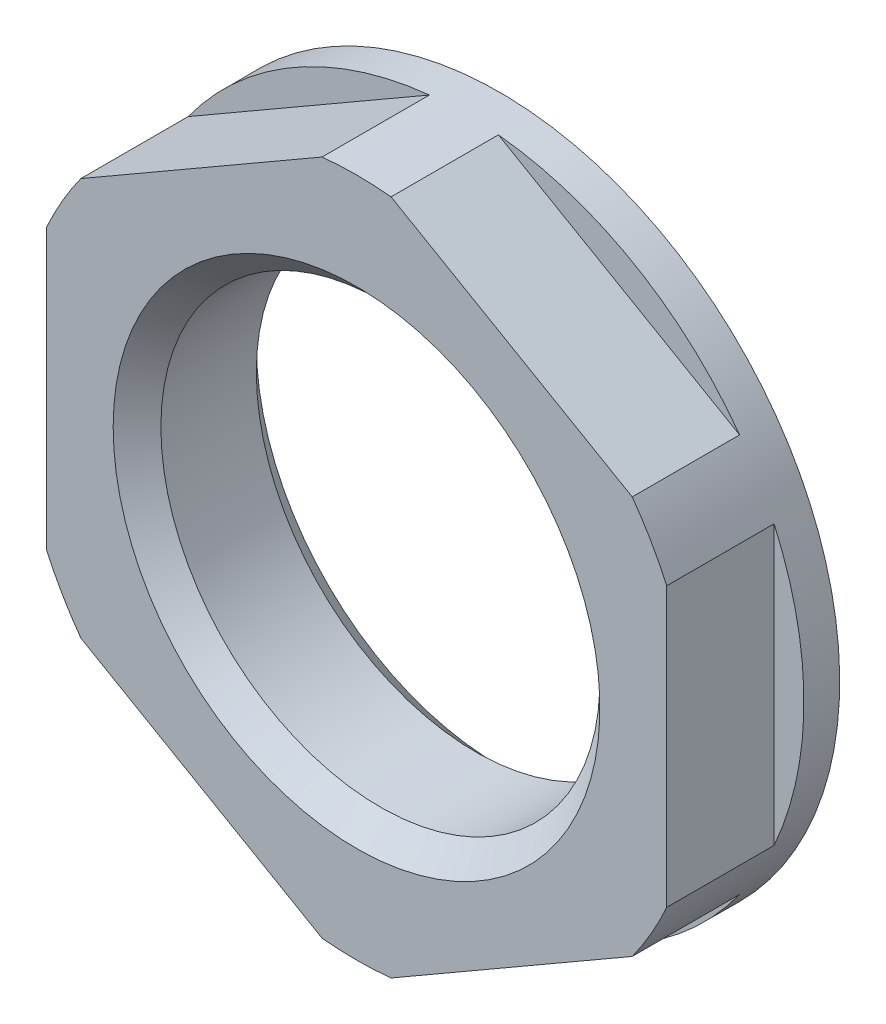
ISO-10303-21;
HEADER;
FILE_DESCRIPTION(('STEP AP214'),'2;1');
FILE_NAME('part.step','',(''),(''),'','','');
FILE_SCHEMA(('AUTOMOTIVE_DESIGN { 1 0 10303 214 1 1 1 1 }'));
ENDSEC;
DATA;
#1=APPLICATION_CONTEXT('core data for automotive mechanical design processes');
#2=APPLICATION_PROTOCOL_DEFINITION('international standard','automotive_design',2000,#1);
#3=PRODUCT_CONTEXT('',#1,'mechanical');
#4=PRODUCT('Part','Part','',(#3));
#5=PRODUCT_RELATED_PRODUCT_CATEGORY('part','',(#4));
#6=PRODUCT_DEFINITION_FORMATION('','',#4);
#7=PRODUCT_DEFINITION_CONTEXT('part definition',#1,'design');
#8=PRODUCT_DEFINITION('design','',#6,#7);
#9=PRODUCT_DEFINITION_SHAPE('','',#8);
#10=(LENGTH_UNIT() NAMED_UNIT(*) SI_UNIT(.MILLI.,.METRE.));
#11=(NAMED_UNIT(*) PLANE_ANGLE_UNIT() SI_UNIT($,.RADIAN.));
#12=(NAMED_UNIT(*) SI_UNIT($,.STERADIAN.) SOLID_ANGLE_UNIT());
#13=UNCERTAINTY_MEASURE_WITH_UNIT(LENGTH_MEASURE(1.E-05),#10,'distance_accuracy_value','');
#14=(GEOMETRIC_REPRESENTATION_CONTEXT(3) GLOBAL_UNCERTAINTY_ASSIGNED_CONTEXT((#13)) GLOBAL_UNIT_ASSIGNED_CONTEXT((#10,
#11,#12)) REPRESENTATION_CONTEXT('',''));
#15=CARTESIAN_POINT('',(0.,0.,0.));
#16=DIRECTION('',(0.,0.,1.));
#17=DIRECTION('',(1.,0.,0.));
#18=AXIS2_PLACEMENT_3D('',#15,#16,#17);
#19=CARTESIAN_POINT('',(13.,7.50555349946514,6.));
#20=DIRECTION('',(-0.500000000000001,-0.866025403784438,0.));
#21=DIRECTION('',(0.866025403784438,-0.500000000000001,0.));
#22=AXIS2_PLACEMENT_3D('',#19,#20,#21);
#23=PLANE('',#22);
#24=DIRECTION('',(0.866025403784438,-0.500000000000001,0.));
#25=VECTOR('',#24,1.);
#26=CARTESIAN_POINT('',(13.,7.50555349946514,1.5));
#27=LINE('',#26,#25);
#28=CARTESIAN_POINT('',(1.4456083452111,14.1764846316799,1.5));
#29=VERTEX_POINT('',#28);
#30=CARTESIAN_POINT('',(11.5543916547889,8.34017586671552,1.5));
#31=VERTEX_POINT('',#30);
#32=EDGE_CURVE('E200',#29,#31,#27,.T.);
#33=ORIENTED_EDGE('',*,*,#32,.F.);
#34=DIRECTION('',(0.,0.,1.));
#35=VECTOR('',#34,1.);
#36=CARTESIAN_POINT('',(1.4456083452111,14.1764846316799,0.));
#37=LINE('',#36,#35);
#38=CARTESIAN_POINT('',(1.44560834521111,14.1764846316799,6.));
#39=VERTEX_POINT('',#38);
#40=EDGE_CURVE('E201',#39,#29,#37,.F.);
#41=ORIENTED_EDGE('',*,*,#40,.F.);
#42=DIRECTION('',(-0.866025403784438,0.500000000000001,0.));
#43=VECTOR('',#42,1.);
#44=CARTESIAN_POINT('',(13.,7.50555349946514,6.));
#45=LINE('',#44,#43);
#46=CARTESIAN_POINT('',(11.5543916547889,8.34017586671553,6.));
#47=VERTEX_POINT('',#46);
#48=EDGE_CURVE('E247',#47,#39,#45,.T.);
#49=ORIENTED_EDGE('',*,*,#48,.F.);
#50=DIRECTION('',(0.,0.,1.));
#51=VECTOR('',#50,1.);
#52=CARTESIAN_POINT('',(11.5543916547889,8.34017586671552,0.));
#53=LINE('',#52,#51);
#54=EDGE_CURVE('E126',#31,#47,#53,.T.);
#55=ORIENTED_EDGE('',*,*,#54,.F.);
#56=EDGE_LOOP('',(#33,#41,#49,#55));
#57=FACE_BOUND('',#56,.T.);
#58=ADVANCED_FACE('F29',(#57),#23,.F.);
#59=CARTESIAN_POINT('',(0.,15.0111069989303,6.));
#60=DIRECTION('',(0.500000000000001,-0.866025403784438,0.));
#61=DIRECTION('',(0.866025403784438,0.500000000000001,0.));
#62=AXIS2_PLACEMENT_3D('',#59,#60,#61);
#63=PLANE('',#62);
#64=DIRECTION('',(0.866025403784438,0.500000000000001,0.));
#65=VECTOR('',#64,1.);
#66=CARTESIAN_POINT('',(0.,15.0111069989303,1.5));
#67=LINE('',#66,#65);
#68=CARTESIAN_POINT('',(-11.5543916547889,8.34017586671553,1.5));
#69=VERTEX_POINT('',#68);
#70=CARTESIAN_POINT('',(-1.4456083452111,14.1764846316799,1.5));
#71=VERTEX_POINT('',#70);
#72=EDGE_CURVE('E204',#69,#71,#67,.T.);
#73=ORIENTED_EDGE('',*,*,#72,.F.);
#74=DIRECTION('',(0.,0.,1.));
#75=VECTOR('',#74,1.);
#76=CARTESIAN_POINT('',(-11.5543916547889,8.34017586671553,0.));
#77=LINE('',#76,#75);
#78=CARTESIAN_POINT('',(-11.5543916547889,8.34017586671553,6.));
#79=VERTEX_POINT('',#78);
#80=EDGE_CURVE('E242',#79,#69,#77,.F.);
#81=ORIENTED_EDGE('',*,*,#80,.F.);
#82=DIRECTION('',(-0.866025403784438,-0.500000000000001,0.));
#83=VECTOR('',#82,1.);
#84=CARTESIAN_POINT('',(0.,15.0111069989303,6.));
#85=LINE('',#84,#83);
#86=CARTESIAN_POINT('',(-1.44560834521111,14.1764846316799,6.));
#87=VERTEX_POINT('',#86);
#88=EDGE_CURVE('E249',#87,#79,#85,.T.);
#89=ORIENTED_EDGE('',*,*,#88,.F.);
#90=DIRECTION('',(0.,0.,1.));
#91=VECTOR('',#90,1.);
#92=CARTESIAN_POINT('',(-1.4456083452111,14.1764846316799,0.));
#93=LINE('',#92,#91);
#94=EDGE_CURVE('E208',#71,#87,#93,.T.);
#95=ORIENTED_EDGE('',*,*,#94,.F.);
#96=EDGE_LOOP('',(#73,#81,#89,#95));
#97=FACE_BOUND('',#96,.T.);
#98=ADVANCED_FACE('F191',(#97),#63,.F.);
#99=CARTESIAN_POINT('',(-13.,7.50555349946514,6.));
#100=DIRECTION('',(1.,0.,0.));
#101=DIRECTION('',(0.,0.,-1.));
#102=AXIS2_PLACEMENT_3D('',#99,#100,#101);
#103=PLANE('',#102);
#104=DIRECTION('',(0.,1.,0.));
#105=VECTOR('',#104,1.);
#106=CARTESIAN_POINT('',(-13.,7.50555349946514,1.5));
#107=LINE('',#106,#105);
#108=CARTESIAN_POINT('',(-13.,-5.83630876496437,1.5));
#109=VERTEX_POINT('',#108);
#110=CARTESIAN_POINT('',(-13.,5.83630876496437,1.5));
#111=VERTEX_POINT('',#110);
#112=EDGE_CURVE('E51',#109,#111,#107,.T.);
#113=ORIENTED_EDGE('',*,*,#112,.F.);
#114=DIRECTION('',(0.,0.,1.));
#115=VECTOR('',#114,1.);
#116=CARTESIAN_POINT('',(-13.,-5.83630876496437,0.));
#117=LINE('',#116,#115);
#118=CARTESIAN_POINT('',(-13.,-5.83630876496437,6.));
#119=VERTEX_POINT('',#118);
#120=EDGE_CURVE('E238',#119,#109,#117,.F.);
#121=ORIENTED_EDGE('',*,*,#120,.F.);
#122=DIRECTION('',(0.,-1.,0.));
#123=VECTOR('',#122,1.);
#124=CARTESIAN_POINT('',(-13.,7.50555349946514,6.));
#125=LINE('',#124,#123);
#126=CARTESIAN_POINT('',(-13.,5.83630876496437,6.));
#127=VERTEX_POINT('',#126);
#128=EDGE_CURVE('E252',#127,#119,#125,.T.);
#129=ORIENTED_EDGE('',*,*,#128,.F.);
#130=DIRECTION('',(0.,0.,1.));
#131=VECTOR('',#130,1.);
#132=CARTESIAN_POINT('',(-13.,5.83630876496437,0.));
#133=LINE('',#132,#131);
#134=EDGE_CURVE('E240',#111,#127,#133,.T.);
#135=ORIENTED_EDGE('',*,*,#134,.F.);
#136=EDGE_LOOP('',(#113,#121,#129,#135));
#137=FACE_BOUND('',#136,.T.);
#138=ADVANCED_FACE('F196',(#137),#103,.F.);
#139=CARTESIAN_POINT('',(-13.,-7.50555349946514,6.));
#140=DIRECTION('',(0.500000000000001,0.866025403784438,0.));
#141=DIRECTION('',(-0.866025403784438,0.500000000000001,0.));
#142=AXIS2_PLACEMENT_3D('',#139,#140,#141);
#143=PLANE('',#142);
#144=DIRECTION('',(-0.866025403784438,0.500000000000001,0.));
#145=VECTOR('',#144,1.);
#146=CARTESIAN_POINT('',(-13.,-7.50555349946514,1.5));
#147=LINE('',#146,#145);
#148=CARTESIAN_POINT('',(-1.44560834521111,-14.1764846316799,1.5));
#149=VERTEX_POINT('',#148);
#150=CARTESIAN_POINT('',(-11.5543916547889,-8.34017586671553,1.5));
#151=VERTEX_POINT('',#150);
#152=EDGE_CURVE('E223',#149,#151,#147,.T.);
#153=ORIENTED_EDGE('',*,*,#152,.F.);
#154=DIRECTION('',(0.,0.,1.));
#155=VECTOR('',#154,1.);
#156=CARTESIAN_POINT('',(-1.44560834521111,-14.1764846316799,0.));
#157=LINE('',#156,#155);
#158=CARTESIAN_POINT('',(-1.44560834521111,-14.1764846316799,6.));
#159=VERTEX_POINT('',#158);
#160=EDGE_CURVE('E234',#159,#149,#157,.F.);
#161=ORIENTED_EDGE('',*,*,#160,.F.);
#162=DIRECTION('',(0.866025403784438,-0.500000000000001,0.));
#163=VECTOR('',#162,1.);
#164=CARTESIAN_POINT('',(-13.,-7.50555349946514,6.));
#165=LINE('',#164,#163);
#166=CARTESIAN_POINT('',(-11.5543916547889,-8.34017586671553,6.));
#167=VERTEX_POINT('',#166);
#168=EDGE_CURVE('E152',#167,#159,#165,.T.);
#169=ORIENTED_EDGE('',*,*,#168,.F.);
#170=DIRECTION('',(0.,0.,1.));
#171=VECTOR('',#170,1.);
#172=CARTESIAN_POINT('',(-11.5543916547889,-8.34017586671553,0.));
#173=LINE('',#172,#171);
#174=EDGE_CURVE('E43',#151,#167,#173,.T.);
#175=ORIENTED_EDGE('',*,*,#174,.F.);
#176=EDGE_LOOP('',(#153,#161,#169,#175));
#177=FACE_BOUND('',#176,.T.);
#178=ADVANCED_FACE('F261',(#177),#143,.F.);
#179=CARTESIAN_POINT('',(0.,-15.0111069989303,6.));
#180=DIRECTION('',(-0.500000000000001,0.866025403784438,0.));
#181=DIRECTION('',(-0.866025403784438,-0.500000000000001,0.));
#182=AXIS2_PLACEMENT_3D('',#179,#180,#181);
#183=PLANE('',#182);
#184=DIRECTION('',(-0.866025403784438,-0.500000000000001,0.));
#185=VECTOR('',#184,1.);
#186=CARTESIAN_POINT('',(0.,-15.0111069989303,1.5));
#187=LINE('',#186,#185);
#188=CARTESIAN_POINT('',(11.5543916547889,-8.34017586671552,1.5));
#189=VERTEX_POINT('',#188);
#190=CARTESIAN_POINT('',(1.4456083452111,-14.1764846316799,1.5));
#191=VERTEX_POINT('',#190);
#192=EDGE_CURVE('E220',#189,#191,#187,.T.);
#193=ORIENTED_EDGE('',*,*,#192,.F.);
#194=DIRECTION('',(0.,0.,1.));
#195=VECTOR('',#194,1.);
#196=CARTESIAN_POINT('',(11.5543916547889,-8.34017586671552,0.));
#197=LINE('',#196,#195);
#198=CARTESIAN_POINT('',(11.5543916547889,-8.34017586671552,6.));
#199=VERTEX_POINT('',#198);
#200=EDGE_CURVE('E229',#199,#189,#197,.F.);
#201=ORIENTED_EDGE('',*,*,#200,.F.);
#202=DIRECTION('',(0.866025403784438,0.500000000000001,0.));
#203=VECTOR('',#202,1.);
#204=CARTESIAN_POINT('',(0.,-15.0111069989303,6.));
#205=LINE('',#204,#203);
#206=CARTESIAN_POINT('',(1.4456083452111,-14.1764846316799,6.));
#207=VERTEX_POINT('',#206);
#208=EDGE_CURVE('E147',#207,#199,#205,.T.);
#209=ORIENTED_EDGE('',*,*,#208,.F.);
#210=DIRECTION('',(0.,0.,1.));
#211=VECTOR('',#210,1.);
#212=CARTESIAN_POINT('',(1.4456083452111,-14.1764846316799,0.));
#213=LINE('',#212,#211);
#214=EDGE_CURVE('E232',#191,#207,#213,.T.);
#215=ORIENTED_EDGE('',*,*,#214,.F.);
#216=EDGE_LOOP('',(#193,#201,#209,#215));
#217=FACE_BOUND('',#216,.T.);
#218=ADVANCED_FACE('F271',(#217),#183,.F.);
#219=CARTESIAN_POINT('',(13.,-7.50555349946514,6.));
#220=DIRECTION('',(-1.,0.,0.));
#221=DIRECTION('',(0.,0.,1.));
#222=AXIS2_PLACEMENT_3D('',#219,#220,#221);
#223=PLANE('',#222);
#224=DIRECTION('',(0.,-1.,0.));
#225=VECTOR('',#224,1.);
#226=CARTESIAN_POINT('',(13.,-7.50555349946514,1.5));
#227=LINE('',#226,#225);
#228=CARTESIAN_POINT('',(13.,5.83630876496438,1.5));
#229=VERTEX_POINT('',#228);
#230=CARTESIAN_POINT('',(13.,-5.83630876496438,1.5));
#231=VERTEX_POINT('',#230);
#232=EDGE_CURVE('E139',#229,#231,#227,.T.);
#233=ORIENTED_EDGE('',*,*,#232,.F.);
#234=DIRECTION('',(0.,0.,1.));
#235=VECTOR('',#234,1.);
#236=CARTESIAN_POINT('',(13.,5.83630876496438,0.));
#237=LINE('',#236,#235);
#238=CARTESIAN_POINT('',(13.,5.83630876496438,6.));
#239=VERTEX_POINT('',#238);
#240=EDGE_CURVE('E123',#239,#229,#237,.F.);
#241=ORIENTED_EDGE('',*,*,#240,.F.);
#242=DIRECTION('',(0.,1.,0.));
#243=VECTOR('',#242,1.);
#244=CARTESIAN_POINT('',(13.,-7.50555349946514,6.));
#245=LINE('',#244,#243);
#246=CARTESIAN_POINT('',(13.,-5.83630876496438,6.));
#247=VERTEX_POINT('',#246);
#248=EDGE_CURVE('E137',#247,#239,#245,.T.);
#249=ORIENTED_EDGE('',*,*,#248,.F.);
#250=DIRECTION('',(0.,0.,1.));
#251=VECTOR('',#250,1.);
#252=CARTESIAN_POINT('',(13.,-5.83630876496438,0.));
#253=LINE('',#252,#251);
#254=EDGE_CURVE('E140',#231,#247,#253,.T.);
#255=ORIENTED_EDGE('',*,*,#254,.F.);
#256=EDGE_LOOP('',(#233,#241,#249,#255));
#257=FACE_BOUND('',#256,.T.);
#258=ADVANCED_FACE('F136',(#257),#223,.F.);
#259=CARTESIAN_POINT('',(26.,0.,6.));
#260=DIRECTION('',(0.,0.,-1.));
#261=DIRECTION('',(-1.,0.,0.));
#262=AXIS2_PLACEMENT_3D('',#259,#260,#261);
#263=PLANE('',#262);
#264=CARTESIAN_POINT('',(0.,0.,6.));
#265=DIRECTION('',(0.,0.,-1.));
#266=DIRECTION('',(-1.,0.,0.));
#267=AXIS2_PLACEMENT_3D('',#264,#265,#266);
#268=CIRCLE('',#267,10.2);
#269=CARTESIAN_POINT('',(-10.2,0.,6.));
#270=VERTEX_POINT('',#269);
#271=EDGE_CURVE('E11',#270,#270,#268,.T.);
#272=ORIENTED_EDGE('',*,*,#271,.T.);
#273=EDGE_LOOP('',(#272));
#274=FACE_BOUND('',#273,.T.);
#275=CARTESIAN_POINT('',(0.,0.,6.));
#276=DIRECTION('',(0.,0.,1.));
#277=DIRECTION('',(1.,0.,0.));
#278=AXIS2_PLACEMENT_3D('',#275,#276,#277);
#279=CIRCLE('',#278,14.25);
#280=EDGE_CURVE('E379',#79,#127,#279,.T.);
#281=ORIENTED_EDGE('',*,*,#280,.T.);
#282=ORIENTED_EDGE('',*,*,#128,.T.);
#283=EDGE_CURVE('E259',#119,#167,#279,.T.);
#284=ORIENTED_EDGE('',*,*,#283,.T.);
#285=ORIENTED_EDGE('',*,*,#168,.T.);
#286=EDGE_CURVE('E257',#159,#207,#279,.T.);
#287=ORIENTED_EDGE('',*,*,#286,.T.);
#288=ORIENTED_EDGE('',*,*,#208,.T.);
#289=EDGE_CURVE('E133',#199,#247,#279,.T.);
#290=ORIENTED_EDGE('',*,*,#289,.T.);
#291=ORIENTED_EDGE('',*,*,#248,.T.);
#292=EDGE_CURVE('E118',#239,#47,#279,.T.);
#293=ORIENTED_EDGE('',*,*,#292,.T.);
#294=ORIENTED_EDGE('',*,*,#48,.T.);
#295=EDGE_CURVE('E131',#39,#87,#279,.T.);
#296=ORIENTED_EDGE('',*,*,#295,.T.);
#297=ORIENTED_EDGE('',*,*,#88,.T.);
#298=EDGE_LOOP('',(#281,#282,#284,#285,#287,#288,#290,#291,#293,#294,#296,#297));
#299=FACE_BOUND('',#298,.T.);
#300=ADVANCED_FACE('F144',(#274,#299),#263,.F.);
#301=CARTESIAN_POINT('',(26.,0.,0.));
#302=DIRECTION('',(0.,0.,-1.));
#303=DIRECTION('',(-1.,0.,0.));
#304=AXIS2_PLACEMENT_3D('',#301,#302,#303);
#305=PLANE('',#304);
#306=CARTESIAN_POINT('',(0.,0.,0.));
#307=DIRECTION('',(0.,0.,-1.));
#308=DIRECTION('',(-1.,0.,0.));
#309=AXIS2_PLACEMENT_3D('',#306,#307,#308);
#310=CIRCLE('',#309,10.2);
#311=CARTESIAN_POINT('',(-10.2,0.,0.));
#312=VERTEX_POINT('',#311);
#313=EDGE_CURVE('E150',#312,#312,#310,.F.);
#314=ORIENTED_EDGE('',*,*,#313,.T.);
#315=EDGE_LOOP('',(#314));
#316=FACE_BOUND('',#315,.T.);
#317=CARTESIAN_POINT('',(0.,0.,0.));
#318=DIRECTION('',(0.,0.,-1.));
#319=DIRECTION('',(-1.,0.,0.));
#320=AXIS2_PLACEMENT_3D('',#317,#318,#319);
#321=CIRCLE('',#320,14.25);
#322=CARTESIAN_POINT('',(-14.25,0.,0.));
#323=VERTEX_POINT('',#322);
#324=EDGE_CURVE('E146',#323,#323,#321,.T.);
#325=ORIENTED_EDGE('',*,*,#324,.T.);
#326=EDGE_LOOP('',(#325));
#327=FACE_BOUND('',#326,.T.);
#328=ADVANCED_FACE('F173',(#316,#327),#305,.T.);
#329=CARTESIAN_POINT('',(0.,0.,0.));
#330=DIRECTION('',(0.,0.,1.));
#331=DIRECTION('',(1.,0.,0.));
#332=AXIS2_PLACEMENT_3D('',#329,#330,#331);
#333=CYLINDRICAL_SURFACE('',#332,14.25);
#334=ORIENTED_EDGE('',*,*,#324,.F.);
#335=EDGE_LOOP('',(#334));
#336=FACE_BOUND('',#335,.T.);
#337=ORIENTED_EDGE('',*,*,#40,.T.);
#338=CARTESIAN_POINT('',(0.,0.,1.5));
#339=DIRECTION('',(0.,0.,-1.));
#340=DIRECTION('',(-1.,0.,0.));
#341=AXIS2_PLACEMENT_3D('',#338,#339,#340);
#342=CIRCLE('',#341,14.25);
#343=EDGE_CURVE('E206',#29,#31,#342,.T.);
#344=ORIENTED_EDGE('',*,*,#343,.T.);
#345=ORIENTED_EDGE('',*,*,#54,.T.);
#346=ORIENTED_EDGE('',*,*,#292,.F.);
#347=ORIENTED_EDGE('',*,*,#240,.T.);
#348=EDGE_CURVE('E211',#229,#231,#342,.T.);
#349=ORIENTED_EDGE('',*,*,#348,.T.);
#350=ORIENTED_EDGE('',*,*,#254,.T.);
#351=ORIENTED_EDGE('',*,*,#289,.F.);
#352=ORIENTED_EDGE('',*,*,#200,.T.);
#353=EDGE_CURVE('E215',#189,#191,#342,.T.);
#354=ORIENTED_EDGE('',*,*,#353,.T.);
#355=ORIENTED_EDGE('',*,*,#214,.T.);
#356=ORIENTED_EDGE('',*,*,#286,.F.);
#357=ORIENTED_EDGE('',*,*,#160,.T.);
#358=EDGE_CURVE('E218',#149,#151,#342,.T.);
#359=ORIENTED_EDGE('',*,*,#358,.T.);
#360=ORIENTED_EDGE('',*,*,#174,.T.);
#361=ORIENTED_EDGE('',*,*,#283,.F.);
#362=ORIENTED_EDGE('',*,*,#120,.T.);
#363=EDGE_CURVE('E214',#109,#111,#342,.T.);
#364=ORIENTED_EDGE('',*,*,#363,.T.);
#365=ORIENTED_EDGE('',*,*,#134,.T.);
#366=ORIENTED_EDGE('',*,*,#280,.F.);
#367=ORIENTED_EDGE('',*,*,#80,.T.);
#368=EDGE_CURVE('E210',#69,#71,#342,.T.);
#369=ORIENTED_EDGE('',*,*,#368,.T.);
#370=ORIENTED_EDGE('',*,*,#94,.T.);
#371=ORIENTED_EDGE('',*,*,#295,.F.);
#372=EDGE_LOOP('',(#337,#344,#345,#346,#347,#349,#350,#351,#352,#354,#355,#356,#357,#359,#360,
#361,#362,#364,#365,#366,#367,#369,#370,#371));
#373=FACE_BOUND('',#372,.T.);
#374=ADVANCED_FACE('F121',(#336,#373),#333,.T.);
#375=CARTESIAN_POINT('',(0.,0.,1.5));
#376=DIRECTION('',(0.,0.,-1.));
#377=DIRECTION('',(-1.,0.,0.));
#378=AXIS2_PLACEMENT_3D('',#375,#376,#377);
#379=PLANE('',#378);
#380=ORIENTED_EDGE('',*,*,#348,.F.);
#381=ORIENTED_EDGE('',*,*,#232,.T.);
#382=EDGE_LOOP('',(#380,#381));
#383=FACE_BOUND('',#382,.T.);
#384=ADVANCED_FACE('F180',(#383),#379,.F.);
#385=ORIENTED_EDGE('',*,*,#353,.F.);
#386=ORIENTED_EDGE('',*,*,#192,.T.);
#387=EDGE_LOOP('',(#385,#386));
#388=FACE_BOUND('',#387,.T.);
#389=ADVANCED_FACE('F186',(#388),#379,.F.);
#390=ORIENTED_EDGE('',*,*,#358,.F.);
#391=ORIENTED_EDGE('',*,*,#152,.T.);
#392=EDGE_LOOP('',(#390,#391));
#393=FACE_BOUND('',#392,.T.);
#394=ADVANCED_FACE('F265',(#393),#379,.F.);
#395=ORIENTED_EDGE('',*,*,#363,.F.);
#396=ORIENTED_EDGE('',*,*,#112,.T.);
#397=EDGE_LOOP('',(#395,#396));
#398=FACE_BOUND('',#397,.T.);
#399=ADVANCED_FACE('F340',(#398),#379,.F.);
#400=ORIENTED_EDGE('',*,*,#368,.F.);
#401=ORIENTED_EDGE('',*,*,#72,.T.);
#402=EDGE_LOOP('',(#400,#401));
#403=FACE_BOUND('',#402,.T.);
#404=ADVANCED_FACE('F346',(#403),#379,.F.);
#405=ORIENTED_EDGE('',*,*,#343,.F.);
#406=ORIENTED_EDGE('',*,*,#32,.T.);
#407=EDGE_LOOP('',(#405,#406));
#408=FACE_BOUND('',#407,.T.);
#409=ADVANCED_FACE('F189',(#408),#379,.F.);
#410=CARTESIAN_POINT('',(0.,0.,0.));
#411=DIRECTION('',(0.,0.,1.));
#412=DIRECTION('',(1.,0.,0.));
#413=AXIS2_PLACEMENT_3D('',#410,#411,#412);
#414=CYLINDRICAL_SURFACE('',#413,9.2);
#415=CARTESIAN_POINT('',(0.,0.,1.00000000000001));
#416=DIRECTION('',(0.,0.,-1.));
#417=DIRECTION('',(-1.,0.,0.));
#418=AXIS2_PLACEMENT_3D('',#415,#416,#417);
#419=CIRCLE('',#418,9.2);
#420=CARTESIAN_POINT('',(-9.2,0.,1.00000000000001));
#421=VERTEX_POINT('',#420);
#422=EDGE_CURVE('E36',#421,#421,#419,.T.);
#423=ORIENTED_EDGE('',*,*,#422,.T.);
#424=EDGE_LOOP('',(#423));
#425=FACE_BOUND('',#424,.T.);
#426=CARTESIAN_POINT('',(0.,0.,5.00000000000001));
#427=DIRECTION('',(0.,0.,-1.));
#428=DIRECTION('',(-1.,0.,0.));
#429=AXIS2_PLACEMENT_3D('',#426,#427,#428);
#430=CIRCLE('',#429,9.2);
#431=CARTESIAN_POINT('',(-9.2,0.,5.00000000000001));
#432=VERTEX_POINT('',#431);
#433=EDGE_CURVE('E158',#432,#432,#430,.F.);
#434=ORIENTED_EDGE('',*,*,#433,.T.);
#435=EDGE_LOOP('',(#434));
#436=FACE_BOUND('',#435,.T.);
#437=ADVANCED_FACE('F163',(#425,#436),#414,.F.);
#438=CARTESIAN_POINT('',(0.,0.,0.));
#439=DIRECTION('',(0.,0.,-1.));
#440=DIRECTION('',(-1.,0.,0.));
#441=AXIS2_PLACEMENT_3D('',#438,#439,#440);
#442=CONICAL_SURFACE('',#441,10.2,0.785398163397444);
#443=ORIENTED_EDGE('',*,*,#422,.F.);
#444=EDGE_LOOP('',(#443));
#445=FACE_BOUND('',#444,.T.);
#446=ORIENTED_EDGE('',*,*,#313,.F.);
#447=EDGE_LOOP('',(#446));
#448=FACE_BOUND('',#447,.T.);
#449=ADVANCED_FACE('F166',(#445,#448),#442,.F.);
#450=CARTESIAN_POINT('',(0.,0.,5.00000000000001));
#451=DIRECTION('',(0.,0.,1.));
#452=DIRECTION('',(1.,0.,0.));
#453=AXIS2_PLACEMENT_3D('',#450,#451,#452);
#454=CONICAL_SURFACE('',#453,9.2,0.785398163397448);
#455=ORIENTED_EDGE('',*,*,#271,.F.);
#456=EDGE_LOOP('',(#455));
#457=FACE_BOUND('',#456,.T.);
#458=ORIENTED_EDGE('',*,*,#433,.F.);
#459=EDGE_LOOP('',(#458));
#460=FACE_BOUND('',#459,.T.);
#461=ADVANCED_FACE('F169',(#457,#460),#454,.F.);
#462=CLOSED_SHELL('',(#58,#98,#138,#178,#218,#258,#300,#328,#374,#384,#389,#394,#399,#404,#409,
#437,#449,#461));
#463=MANIFOLD_SOLID_BREP('B2',#462);
#464=ADVANCED_BREP_SHAPE_REPRESENTATION('',(#18,#463),#14);
#465=SHAPE_DEFINITION_REPRESENTATION(#9,#464);
ENDSEC;
END-ISO-10303-21;
